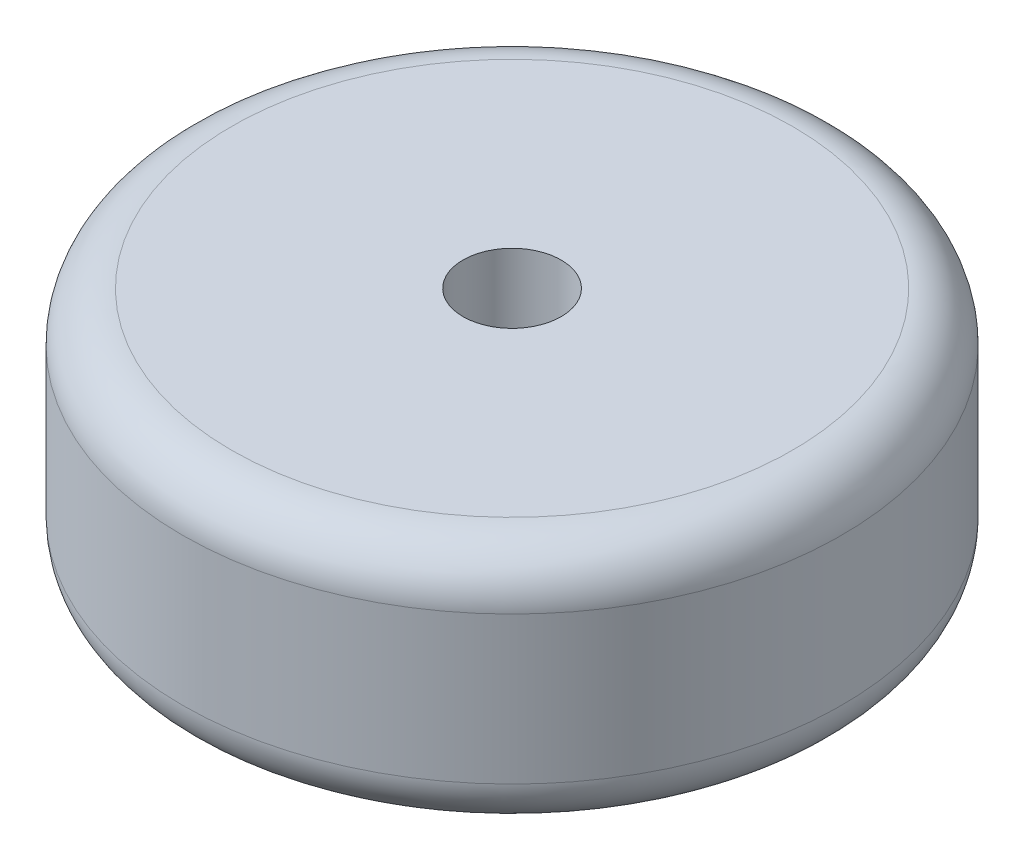
ISO-10303-21;
HEADER;
FILE_DESCRIPTION(('STEP AP214'),'2;1');
FILE_NAME('part.step','',(''),(''),'','','');
FILE_SCHEMA(('AUTOMOTIVE_DESIGN { 1 0 10303 214 1 1 1 1 }'));
ENDSEC;
DATA;
#1=APPLICATION_CONTEXT('core data for automotive mechanical design processes');
#2=APPLICATION_PROTOCOL_DEFINITION('international standard','automotive_design',2000,#1);
#3=PRODUCT_CONTEXT('',#1,'mechanical');
#4=PRODUCT('Part','Part','',(#3));
#5=PRODUCT_RELATED_PRODUCT_CATEGORY('part','',(#4));
#6=PRODUCT_DEFINITION_FORMATION('','',#4);
#7=PRODUCT_DEFINITION_CONTEXT('part definition',#1,'design');
#8=PRODUCT_DEFINITION('design','',#6,#7);
#9=PRODUCT_DEFINITION_SHAPE('','',#8);
#10=(LENGTH_UNIT() NAMED_UNIT(*) SI_UNIT(.MILLI.,.METRE.));
#11=(NAMED_UNIT(*) PLANE_ANGLE_UNIT() SI_UNIT($,.RADIAN.));
#12=(NAMED_UNIT(*) SI_UNIT($,.STERADIAN.) SOLID_ANGLE_UNIT());
#13=UNCERTAINTY_MEASURE_WITH_UNIT(LENGTH_MEASURE(1.E-05),#10,'distance_accuracy_value','');
#14=(GEOMETRIC_REPRESENTATION_CONTEXT(3) GLOBAL_UNCERTAINTY_ASSIGNED_CONTEXT((#13)) GLOBAL_UNIT_ASSIGNED_CONTEXT((#10,
#11,#12)) REPRESENTATION_CONTEXT('',''));
#15=CARTESIAN_POINT('',(0.,0.,0.));
#16=DIRECTION('',(0.,0.,1.));
#17=DIRECTION('',(1.,0.,0.));
#18=AXIS2_PLACEMENT_3D('',#15,#16,#17);
#19=CARTESIAN_POINT('',(0.,5.,0.));
#20=DIRECTION('',(0.,-1.,0.));
#21=DIRECTION('',(0.,0.,-1.));
#22=AXIS2_PLACEMENT_3D('',#19,#20,#21);
#23=CYLINDRICAL_SURFACE('',#22,6.715);
#24=CARTESIAN_POINT('',(0.,1.,0.));
#25=DIRECTION('',(0.,1.,0.));
#26=DIRECTION('',(0.,0.,1.));
#27=AXIS2_PLACEMENT_3D('',#24,#25,#26);
#28=CIRCLE('',#27,6.715);
#29=CARTESIAN_POINT('',(0.,1.,6.715));
#30=VERTEX_POINT('',#29);
#31=EDGE_CURVE('E56',#30,#30,#28,.T.);
#32=ORIENTED_EDGE('',*,*,#31,.T.);
#33=EDGE_LOOP('',(#32));
#34=FACE_BOUND('',#33,.T.);
#35=CARTESIAN_POINT('',(0.,4.,0.));
#36=DIRECTION('',(0.,1.,0.));
#37=DIRECTION('',(0.,0.,1.));
#38=AXIS2_PLACEMENT_3D('',#35,#36,#37);
#39=CIRCLE('',#38,6.715);
#40=CARTESIAN_POINT('',(0.,4.,6.715));
#41=VERTEX_POINT('',#40);
#42=EDGE_CURVE('E60',#41,#41,#39,.F.);
#43=ORIENTED_EDGE('',*,*,#42,.T.);
#44=EDGE_LOOP('',(#43));
#45=FACE_BOUND('',#44,.T.);
#46=ADVANCED_FACE('F45',(#34,#45),#23,.T.);
#47=CARTESIAN_POINT('',(0.,5.,0.));
#48=DIRECTION('',(0.,1.,0.));
#49=DIRECTION('',(0.,0.,1.));
#50=AXIS2_PLACEMENT_3D('',#47,#48,#49);
#51=PLANE('',#50);
#52=CARTESIAN_POINT('',(0.,5.,0.));
#53=DIRECTION('',(0.,1.,0.));
#54=DIRECTION('',(0.,0.,1.));
#55=AXIS2_PLACEMENT_3D('',#52,#53,#54);
#56=CIRCLE('',#55,1.);
#57=CARTESIAN_POINT('',(0.,5.,1.));
#58=VERTEX_POINT('',#57);
#59=EDGE_CURVE('E68',#58,#58,#56,.T.);
#60=ORIENTED_EDGE('',*,*,#59,.F.);
#61=EDGE_LOOP('',(#60));
#62=FACE_BOUND('',#61,.T.);
#63=CARTESIAN_POINT('',(0.,5.,0.));
#64=DIRECTION('',(0.,1.,0.));
#65=DIRECTION('',(0.,0.,1.));
#66=AXIS2_PLACEMENT_3D('',#63,#64,#65);
#67=CIRCLE('',#66,5.715);
#68=CARTESIAN_POINT('',(0.,5.,5.715));
#69=VERTEX_POINT('',#68);
#70=EDGE_CURVE('E10',#69,#69,#67,.T.);
#71=ORIENTED_EDGE('',*,*,#70,.T.);
#72=EDGE_LOOP('',(#71));
#73=FACE_BOUND('',#72,.T.);
#74=ADVANCED_FACE('F75',(#62,#73),#51,.T.);
#75=CARTESIAN_POINT('',(0.,0.,0.));
#76=DIRECTION('',(0.,1.,0.));
#77=DIRECTION('',(0.,0.,1.));
#78=AXIS2_PLACEMENT_3D('',#75,#76,#77);
#79=PLANE('',#78);
#80=CARTESIAN_POINT('',(0.,0.,0.));
#81=DIRECTION('',(0.,1.,0.));
#82=DIRECTION('',(0.,0.,1.));
#83=AXIS2_PLACEMENT_3D('',#80,#81,#82);
#84=CIRCLE('',#83,1.);
#85=CARTESIAN_POINT('',(0.,0.,1.));
#86=VERTEX_POINT('',#85);
#87=EDGE_CURVE('E65',#86,#86,#84,.F.);
#88=ORIENTED_EDGE('',*,*,#87,.F.);
#89=EDGE_LOOP('',(#88));
#90=FACE_BOUND('',#89,.T.);
#91=CARTESIAN_POINT('',(0.,0.,0.));
#92=DIRECTION('',(0.,1.,0.));
#93=DIRECTION('',(0.,0.,1.));
#94=AXIS2_PLACEMENT_3D('',#91,#92,#93);
#95=CIRCLE('',#94,5.715);
#96=CARTESIAN_POINT('',(0.,0.,5.715));
#97=VERTEX_POINT('',#96);
#98=EDGE_CURVE('E52',#97,#97,#95,.F.);
#99=ORIENTED_EDGE('',*,*,#98,.T.);
#100=EDGE_LOOP('',(#99));
#101=FACE_BOUND('',#100,.T.);
#102=ADVANCED_FACE('F77',(#90,#101),#79,.F.);
#103=CARTESIAN_POINT('',(0.,1.,0.));
#104=DIRECTION('',(0.,1.,0.));
#105=DIRECTION('',(0.,0.,1.));
#106=AXIS2_PLACEMENT_3D('',#103,#104,#105);
#107=TOROIDAL_SURFACE('',#106,5.715,1.);
#108=ORIENTED_EDGE('',*,*,#98,.F.);
#109=EDGE_LOOP('',(#108));
#110=FACE_BOUND('',#109,.T.);
#111=ORIENTED_EDGE('',*,*,#31,.F.);
#112=EDGE_LOOP('',(#111));
#113=FACE_BOUND('',#112,.T.);
#114=ADVANCED_FACE('F82',(#110,#113),#107,.T.);
#115=CARTESIAN_POINT('',(0.,4.,0.));
#116=DIRECTION('',(0.,1.,0.));
#117=DIRECTION('',(0.,0.,1.));
#118=AXIS2_PLACEMENT_3D('',#115,#116,#117);
#119=TOROIDAL_SURFACE('',#118,5.715,1.);
#120=ORIENTED_EDGE('',*,*,#42,.F.);
#121=EDGE_LOOP('',(#120));
#122=FACE_BOUND('',#121,.T.);
#123=ORIENTED_EDGE('',*,*,#70,.F.);
#124=EDGE_LOOP('',(#123));
#125=FACE_BOUND('',#124,.T.);
#126=ADVANCED_FACE('F47',(#122,#125),#119,.T.);
#127=CARTESIAN_POINT('',(0.,-0.00100000000000013,0.));
#128=DIRECTION('',(0.,1.,0.));
#129=DIRECTION('',(0.,0.,1.));
#130=AXIS2_PLACEMENT_3D('',#127,#128,#129);
#131=CYLINDRICAL_SURFACE('',#130,1.);
#132=ORIENTED_EDGE('',*,*,#59,.T.);
#133=EDGE_LOOP('',(#132));
#134=FACE_BOUND('',#133,.T.);
#135=ORIENTED_EDGE('',*,*,#87,.T.);
#136=EDGE_LOOP('',(#135));
#137=FACE_BOUND('',#136,.T.);
#138=ADVANCED_FACE('F72',(#134,#137),#131,.F.);
#139=CLOSED_SHELL('',(#46,#74,#102,#114,#126,#138));
#140=MANIFOLD_SOLID_BREP('B2',#139);
#141=ADVANCED_BREP_SHAPE_REPRESENTATION('',(#18,#140),#14);
#142=SHAPE_DEFINITION_REPRESENTATION(#9,#141);
ENDSEC;
END-ISO-10303-21;
